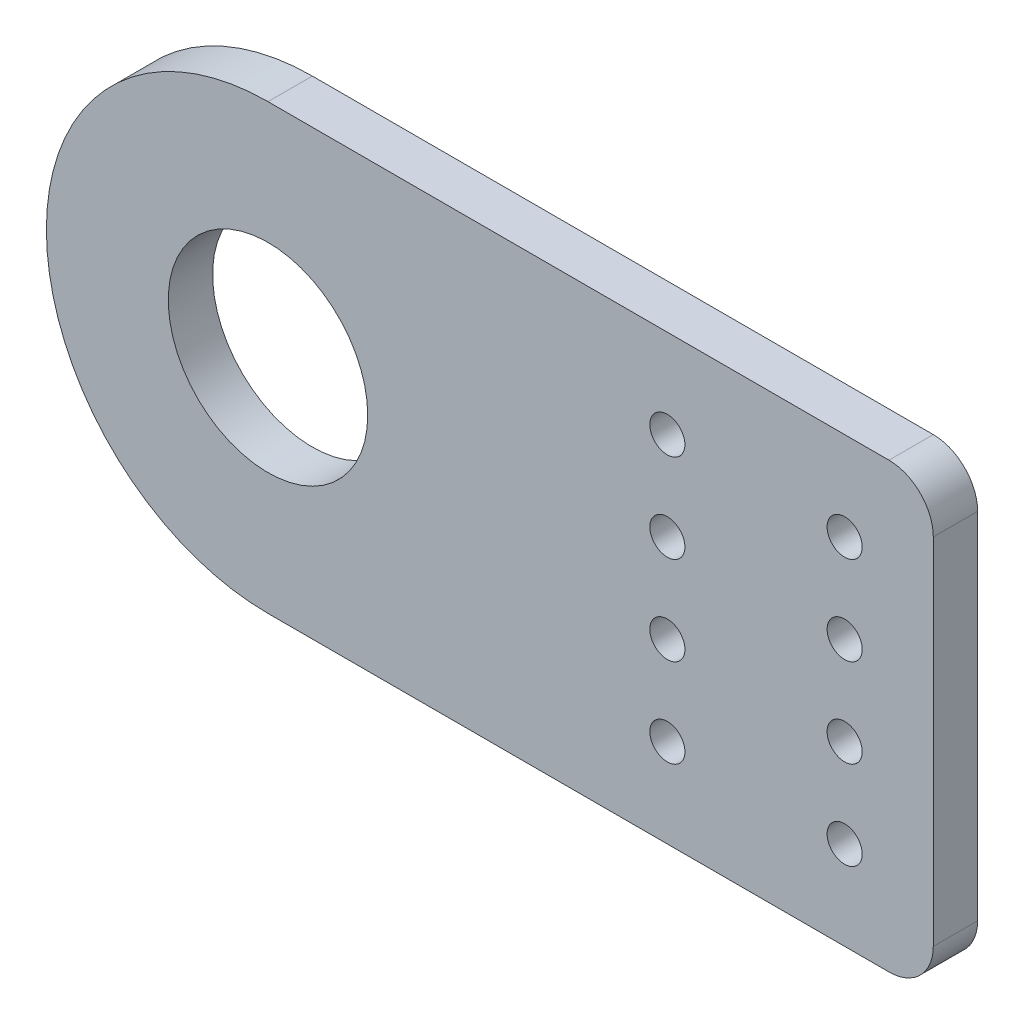
ISO-10303-21;
HEADER;
FILE_DESCRIPTION(('STEP AP214'),'2;1');
FILE_NAME('part.step','',(''),(''),'','','');
FILE_SCHEMA(('AUTOMOTIVE_DESIGN { 1 0 10303 214 1 1 1 1 }'));
ENDSEC;
DATA;
#1=APPLICATION_CONTEXT('core data for automotive mechanical design processes');
#2=APPLICATION_PROTOCOL_DEFINITION('international standard','automotive_design',2000,#1);
#3=PRODUCT_CONTEXT('',#1,'mechanical');
#4=PRODUCT('Part','Part','',(#3));
#5=PRODUCT_RELATED_PRODUCT_CATEGORY('part','',(#4));
#6=PRODUCT_DEFINITION_FORMATION('','',#4);
#7=PRODUCT_DEFINITION_CONTEXT('part definition',#1,'design');
#8=PRODUCT_DEFINITION('design','',#6,#7);
#9=PRODUCT_DEFINITION_SHAPE('','',#8);
#10=(LENGTH_UNIT() NAMED_UNIT(*) SI_UNIT(.MILLI.,.METRE.));
#11=(NAMED_UNIT(*) PLANE_ANGLE_UNIT() SI_UNIT($,.RADIAN.));
#12=(NAMED_UNIT(*) SI_UNIT($,.STERADIAN.) SOLID_ANGLE_UNIT());
#13=UNCERTAINTY_MEASURE_WITH_UNIT(LENGTH_MEASURE(1.E-05),#10,'distance_accuracy_value','');
#14=(GEOMETRIC_REPRESENTATION_CONTEXT(3) GLOBAL_UNCERTAINTY_ASSIGNED_CONTEXT((#13)) GLOBAL_UNIT_ASSIGNED_CONTEXT((#10,
#11,#12)) REPRESENTATION_CONTEXT('',''));
#15=CARTESIAN_POINT('',(0.,0.,0.));
#16=DIRECTION('',(0.,0.,1.));
#17=DIRECTION('',(1.,0.,0.));
#18=AXIS2_PLACEMENT_3D('',#15,#16,#17);
#19=CARTESIAN_POINT('',(-44.5121536799579,100.012500000049,6.35));
#20=DIRECTION('',(0.,0.,1.));
#21=DIRECTION('',(1.,0.,0.));
#22=AXIS2_PLACEMENT_3D('',#19,#20,#21);
#23=PLANE('',#22);
#24=CARTESIAN_POINT('',(12.7,119.062500000049,6.35));
#25=DIRECTION('',(0.,0.,1.));
#26=DIRECTION('',(1.,0.,0.));
#27=AXIS2_PLACEMENT_3D('',#24,#25,#26);
#28=CIRCLE('',#27,2.5146);
#29=CARTESIAN_POINT('',(15.2146,119.062500000049,6.35));
#30=VERTEX_POINT('',#29);
#31=EDGE_CURVE('E354',#30,#30,#28,.T.);
#32=ORIENTED_EDGE('',*,*,#31,.F.);
#33=EDGE_LOOP('',(#32));
#34=FACE_BOUND('',#33,.T.);
#35=CARTESIAN_POINT('',(12.7,93.662500000049,6.35));
#36=DIRECTION('',(0.,0.,1.));
#37=DIRECTION('',(1.,0.,0.));
#38=AXIS2_PLACEMENT_3D('',#35,#36,#37);
#39=CIRCLE('',#38,2.5146);
#40=CARTESIAN_POINT('',(15.2146,93.662500000049,6.35));
#41=VERTEX_POINT('',#40);
#42=EDGE_CURVE('E366',#41,#41,#39,.T.);
#43=ORIENTED_EDGE('',*,*,#42,.F.);
#44=EDGE_LOOP('',(#43));
#45=FACE_BOUND('',#44,.T.);
#46=CARTESIAN_POINT('',(38.1,80.962500000049,6.35));
#47=DIRECTION('',(0.,0.,1.));
#48=DIRECTION('',(1.,0.,0.));
#49=AXIS2_PLACEMENT_3D('',#46,#47,#48);
#50=CIRCLE('',#49,2.5146);
#51=CARTESIAN_POINT('',(40.6146,80.962500000049,6.35));
#52=VERTEX_POINT('',#51);
#53=EDGE_CURVE('E378',#52,#52,#50,.T.);
#54=ORIENTED_EDGE('',*,*,#53,.F.);
#55=EDGE_LOOP('',(#54));
#56=FACE_BOUND('',#55,.T.);
#57=CARTESIAN_POINT('',(38.1,106.362500000049,6.35));
#58=DIRECTION('',(0.,0.,1.));
#59=DIRECTION('',(1.,0.,0.));
#60=AXIS2_PLACEMENT_3D('',#57,#58,#59);
#61=CIRCLE('',#60,2.5146);
#62=CARTESIAN_POINT('',(40.6146,106.362500000049,6.35));
#63=VERTEX_POINT('',#62);
#64=EDGE_CURVE('E390',#63,#63,#61,.T.);
#65=ORIENTED_EDGE('',*,*,#64,.F.);
#66=EDGE_LOOP('',(#65));
#67=FACE_BOUND('',#66,.T.);
#68=DIRECTION('',(1.,0.,0.));
#69=VECTOR('',#68,1.);
#70=CARTESIAN_POINT('',(-44.5121536799579,68.262500000049,6.35));
#71=LINE('',#70,#69);
#72=CARTESIAN_POINT('',(-44.5121536799579,68.262500000049,6.35));
#73=VERTEX_POINT('',#72);
#74=CARTESIAN_POINT('',(44.45,68.262500000049,6.35));
#75=VERTEX_POINT('',#74);
#76=EDGE_CURVE('E92',#73,#75,#71,.T.);
#77=ORIENTED_EDGE('',*,*,#76,.T.);
#78=CARTESIAN_POINT('',(44.45,74.612500000049,6.35));
#79=DIRECTION('',(0.,0.,1.));
#80=DIRECTION('',(1.,0.,0.));
#81=AXIS2_PLACEMENT_3D('',#78,#79,#80);
#82=CIRCLE('',#81,6.35);
#83=CARTESIAN_POINT('',(50.8,74.612500000049,6.35));
#84=VERTEX_POINT('',#83);
#85=EDGE_CURVE('E47',#75,#84,#82,.T.);
#86=ORIENTED_EDGE('',*,*,#85,.T.);
#87=DIRECTION('',(0.,1.,0.));
#88=VECTOR('',#87,1.);
#89=CARTESIAN_POINT('',(50.8,68.262500000049,6.35));
#90=LINE('',#89,#88);
#91=CARTESIAN_POINT('',(50.8,125.412500000049,6.35));
#92=VERTEX_POINT('',#91);
#93=EDGE_CURVE('E99',#84,#92,#90,.T.);
#94=ORIENTED_EDGE('',*,*,#93,.T.);
#95=CARTESIAN_POINT('',(44.45,125.412500000049,6.35));
#96=DIRECTION('',(0.,0.,1.));
#97=DIRECTION('',(1.,0.,0.));
#98=AXIS2_PLACEMENT_3D('',#95,#96,#97);
#99=CIRCLE('',#98,6.35);
#100=CARTESIAN_POINT('',(44.45,131.762500000049,6.35));
#101=VERTEX_POINT('',#100);
#102=EDGE_CURVE('E54',#92,#101,#99,.T.);
#103=ORIENTED_EDGE('',*,*,#102,.T.);
#104=DIRECTION('',(-1.,0.,0.));
#105=VECTOR('',#104,1.);
#106=CARTESIAN_POINT('',(-44.5121536799579,131.762500000049,6.35));
#107=LINE('',#106,#105);
#108=CARTESIAN_POINT('',(-44.5121536799579,131.762500000049,6.35));
#109=VERTEX_POINT('',#108);
#110=EDGE_CURVE('E104',#101,#109,#107,.T.);
#111=ORIENTED_EDGE('',*,*,#110,.T.);
#112=CARTESIAN_POINT('',(-44.5121536799579,100.012500000049,6.35));
#113=DIRECTION('',(0.,0.,1.));
#114=DIRECTION('',(1.,0.,0.));
#115=AXIS2_PLACEMENT_3D('',#112,#113,#114);
#116=CIRCLE('',#115,31.75);
#117=EDGE_CURVE('E100',#109,#73,#116,.T.);
#118=ORIENTED_EDGE('',*,*,#117,.T.);
#119=EDGE_LOOP('',(#77,#86,#94,#103,#111,#118));
#120=FACE_BOUND('',#119,.T.);
#121=CARTESIAN_POINT('',(38.1,119.062500000049,6.35));
#122=DIRECTION('',(0.,0.,1.));
#123=DIRECTION('',(1.,0.,0.));
#124=AXIS2_PLACEMENT_3D('',#121,#122,#123);
#125=CIRCLE('',#124,2.51460000000001);
#126=CARTESIAN_POINT('',(40.6146,119.062500000049,6.35));
#127=VERTEX_POINT('',#126);
#128=EDGE_CURVE('E145',#127,#127,#125,.T.);
#129=ORIENTED_EDGE('',*,*,#128,.F.);
#130=EDGE_LOOP('',(#129));
#131=FACE_BOUND('',#130,.T.);
#132=CARTESIAN_POINT('',(38.1,93.662500000049,6.35));
#133=DIRECTION('',(0.,0.,1.));
#134=DIRECTION('',(1.,0.,0.));
#135=AXIS2_PLACEMENT_3D('',#132,#133,#134);
#136=CIRCLE('',#135,2.5146);
#137=CARTESIAN_POINT('',(40.6146,93.662500000049,6.35));
#138=VERTEX_POINT('',#137);
#139=EDGE_CURVE('E384',#138,#138,#136,.T.);
#140=ORIENTED_EDGE('',*,*,#139,.F.);
#141=EDGE_LOOP('',(#140));
#142=FACE_BOUND('',#141,.T.);
#143=CARTESIAN_POINT('',(12.7,80.962500000049,6.35));
#144=DIRECTION('',(0.,0.,1.));
#145=DIRECTION('',(1.,0.,0.));
#146=AXIS2_PLACEMENT_3D('',#143,#144,#145);
#147=CIRCLE('',#146,2.5146);
#148=CARTESIAN_POINT('',(15.2146,80.962500000049,6.35));
#149=VERTEX_POINT('',#148);
#150=EDGE_CURVE('E372',#149,#149,#147,.T.);
#151=ORIENTED_EDGE('',*,*,#150,.F.);
#152=EDGE_LOOP('',(#151));
#153=FACE_BOUND('',#152,.T.);
#154=CARTESIAN_POINT('',(12.7,106.362500000049,6.35));
#155=DIRECTION('',(0.,0.,1.));
#156=DIRECTION('',(1.,0.,0.));
#157=AXIS2_PLACEMENT_3D('',#154,#155,#156);
#158=CIRCLE('',#157,2.5146);
#159=CARTESIAN_POINT('',(15.2146,106.362500000049,6.35));
#160=VERTEX_POINT('',#159);
#161=EDGE_CURVE('E360',#160,#160,#158,.T.);
#162=ORIENTED_EDGE('',*,*,#161,.F.);
#163=EDGE_LOOP('',(#162));
#164=FACE_BOUND('',#163,.T.);
#165=CARTESIAN_POINT('',(-44.5121536799579,100.012500000049,6.35));
#166=DIRECTION('',(0.,0.,1.));
#167=DIRECTION('',(1.,0.,0.));
#168=AXIS2_PLACEMENT_3D('',#165,#166,#167);
#169=CIRCLE('',#168,14.2875);
#170=CARTESIAN_POINT('',(-30.2246536799579,100.012500000049,6.35));
#171=VERTEX_POINT('',#170);
#172=EDGE_CURVE('E345',#171,#171,#169,.T.);
#173=ORIENTED_EDGE('',*,*,#172,.F.);
#174=EDGE_LOOP('',(#173));
#175=FACE_BOUND('',#174,.T.);
#176=ADVANCED_FACE('F39',(#34,#45,#56,#67,#120,#131,#142,#153,#164,#175),#23,.T.);
#177=CARTESIAN_POINT('',(-44.5121536799579,100.012500000049,0.));
#178=DIRECTION('',(0.,0.,1.));
#179=DIRECTION('',(1.,0.,0.));
#180=AXIS2_PLACEMENT_3D('',#177,#178,#179);
#181=PLANE('',#180);
#182=DIRECTION('',(0.,1.,0.));
#183=VECTOR('',#182,1.);
#184=CARTESIAN_POINT('',(50.8,68.262500000049,0.));
#185=LINE('',#184,#183);
#186=CARTESIAN_POINT('',(50.8,74.612500000049,0.));
#187=VERTEX_POINT('',#186);
#188=CARTESIAN_POINT('',(50.8,125.412500000049,0.));
#189=VERTEX_POINT('',#188);
#190=EDGE_CURVE('E142',#187,#189,#185,.T.);
#191=ORIENTED_EDGE('',*,*,#190,.F.);
#192=CARTESIAN_POINT('',(44.45,74.612500000049,0.));
#193=DIRECTION('',(0.,0.,1.));
#194=DIRECTION('',(1.,0.,0.));
#195=AXIS2_PLACEMENT_3D('',#192,#193,#194);
#196=CIRCLE('',#195,6.35);
#197=CARTESIAN_POINT('',(44.45,68.262500000049,0.));
#198=VERTEX_POINT('',#197);
#199=EDGE_CURVE('E125',#187,#198,#196,.F.);
#200=ORIENTED_EDGE('',*,*,#199,.T.);
#201=DIRECTION('',(1.,0.,0.));
#202=VECTOR('',#201,1.);
#203=CARTESIAN_POINT('',(-44.5121536799579,68.262500000049,0.));
#204=LINE('',#203,#202);
#205=CARTESIAN_POINT('',(-44.5121536799579,68.262500000049,0.));
#206=VERTEX_POINT('',#205);
#207=EDGE_CURVE('E141',#206,#198,#204,.T.);
#208=ORIENTED_EDGE('',*,*,#207,.F.);
#209=CARTESIAN_POINT('',(-44.5121536799579,100.012500000049,0.));
#210=DIRECTION('',(0.,0.,1.));
#211=DIRECTION('',(1.,0.,0.));
#212=AXIS2_PLACEMENT_3D('',#209,#210,#211);
#213=CIRCLE('',#212,31.75);
#214=CARTESIAN_POINT('',(-44.5121536799579,131.762500000049,0.));
#215=VERTEX_POINT('',#214);
#216=EDGE_CURVE('E112',#215,#206,#213,.T.);
#217=ORIENTED_EDGE('',*,*,#216,.F.);
#218=DIRECTION('',(-1.,0.,0.));
#219=VECTOR('',#218,1.);
#220=CARTESIAN_POINT('',(-44.5121536799579,131.762500000049,0.));
#221=LINE('',#220,#219);
#222=CARTESIAN_POINT('',(44.45,131.762500000049,0.));
#223=VERTEX_POINT('',#222);
#224=EDGE_CURVE('E108',#223,#215,#221,.T.);
#225=ORIENTED_EDGE('',*,*,#224,.F.);
#226=CARTESIAN_POINT('',(44.45,125.412500000049,0.));
#227=DIRECTION('',(0.,0.,1.));
#228=DIRECTION('',(1.,0.,0.));
#229=AXIS2_PLACEMENT_3D('',#226,#227,#228);
#230=CIRCLE('',#229,6.35);
#231=EDGE_CURVE('E123',#223,#189,#230,.F.);
#232=ORIENTED_EDGE('',*,*,#231,.T.);
#233=EDGE_LOOP('',(#191,#200,#208,#217,#225,#232));
#234=FACE_BOUND('',#233,.T.);
#235=CARTESIAN_POINT('',(38.1,119.062500000049,0.));
#236=DIRECTION('',(0.,0.,1.));
#237=DIRECTION('',(1.,0.,0.));
#238=AXIS2_PLACEMENT_3D('',#235,#236,#237);
#239=CIRCLE('',#238,2.51460000000001);
#240=CARTESIAN_POINT('',(40.6146,119.062500000049,0.));
#241=VERTEX_POINT('',#240);
#242=EDGE_CURVE('E393',#241,#241,#239,.T.);
#243=ORIENTED_EDGE('',*,*,#242,.T.);
#244=EDGE_LOOP('',(#243));
#245=FACE_BOUND('',#244,.T.);
#246=CARTESIAN_POINT('',(38.1,106.362500000049,0.));
#247=DIRECTION('',(0.,0.,1.));
#248=DIRECTION('',(1.,0.,0.));
#249=AXIS2_PLACEMENT_3D('',#246,#247,#248);
#250=CIRCLE('',#249,2.5146);
#251=CARTESIAN_POINT('',(40.6146,106.362500000049,0.));
#252=VERTEX_POINT('',#251);
#253=EDGE_CURVE('E387',#252,#252,#250,.T.);
#254=ORIENTED_EDGE('',*,*,#253,.T.);
#255=EDGE_LOOP('',(#254));
#256=FACE_BOUND('',#255,.T.);
#257=CARTESIAN_POINT('',(38.1,93.662500000049,0.));
#258=DIRECTION('',(0.,0.,1.));
#259=DIRECTION('',(1.,0.,0.));
#260=AXIS2_PLACEMENT_3D('',#257,#258,#259);
#261=CIRCLE('',#260,2.5146);
#262=CARTESIAN_POINT('',(40.6146,93.662500000049,0.));
#263=VERTEX_POINT('',#262);
#264=EDGE_CURVE('E381',#263,#263,#261,.T.);
#265=ORIENTED_EDGE('',*,*,#264,.T.);
#266=EDGE_LOOP('',(#265));
#267=FACE_BOUND('',#266,.T.);
#268=CARTESIAN_POINT('',(38.1,80.962500000049,0.));
#269=DIRECTION('',(0.,0.,1.));
#270=DIRECTION('',(1.,0.,0.));
#271=AXIS2_PLACEMENT_3D('',#268,#269,#270);
#272=CIRCLE('',#271,2.5146);
#273=CARTESIAN_POINT('',(40.6146,80.962500000049,0.));
#274=VERTEX_POINT('',#273);
#275=EDGE_CURVE('E375',#274,#274,#272,.T.);
#276=ORIENTED_EDGE('',*,*,#275,.T.);
#277=EDGE_LOOP('',(#276));
#278=FACE_BOUND('',#277,.T.);
#279=CARTESIAN_POINT('',(12.7,80.962500000049,0.));
#280=DIRECTION('',(0.,0.,1.));
#281=DIRECTION('',(1.,0.,0.));
#282=AXIS2_PLACEMENT_3D('',#279,#280,#281);
#283=CIRCLE('',#282,2.5146);
#284=CARTESIAN_POINT('',(15.2146,80.962500000049,0.));
#285=VERTEX_POINT('',#284);
#286=EDGE_CURVE('E369',#285,#285,#283,.T.);
#287=ORIENTED_EDGE('',*,*,#286,.T.);
#288=EDGE_LOOP('',(#287));
#289=FACE_BOUND('',#288,.T.);
#290=CARTESIAN_POINT('',(12.7,93.662500000049,0.));
#291=DIRECTION('',(0.,0.,1.));
#292=DIRECTION('',(1.,0.,0.));
#293=AXIS2_PLACEMENT_3D('',#290,#291,#292);
#294=CIRCLE('',#293,2.5146);
#295=CARTESIAN_POINT('',(15.2146,93.662500000049,0.));
#296=VERTEX_POINT('',#295);
#297=EDGE_CURVE('E363',#296,#296,#294,.T.);
#298=ORIENTED_EDGE('',*,*,#297,.T.);
#299=EDGE_LOOP('',(#298));
#300=FACE_BOUND('',#299,.T.);
#301=CARTESIAN_POINT('',(12.7,106.362500000049,0.));
#302=DIRECTION('',(0.,0.,1.));
#303=DIRECTION('',(1.,0.,0.));
#304=AXIS2_PLACEMENT_3D('',#301,#302,#303);
#305=CIRCLE('',#304,2.5146);
#306=CARTESIAN_POINT('',(15.2146,106.362500000049,0.));
#307=VERTEX_POINT('',#306);
#308=EDGE_CURVE('E357',#307,#307,#305,.T.);
#309=ORIENTED_EDGE('',*,*,#308,.T.);
#310=EDGE_LOOP('',(#309));
#311=FACE_BOUND('',#310,.T.);
#312=CARTESIAN_POINT('',(12.7,119.062500000049,0.));
#313=DIRECTION('',(0.,0.,1.));
#314=DIRECTION('',(1.,0.,0.));
#315=AXIS2_PLACEMENT_3D('',#312,#313,#314);
#316=CIRCLE('',#315,2.5146);
#317=CARTESIAN_POINT('',(15.2146,119.062500000049,0.));
#318=VERTEX_POINT('',#317);
#319=EDGE_CURVE('E351',#318,#318,#316,.T.);
#320=ORIENTED_EDGE('',*,*,#319,.T.);
#321=EDGE_LOOP('',(#320));
#322=FACE_BOUND('',#321,.T.);
#323=CARTESIAN_POINT('',(-44.5121536799579,100.012500000049,0.));
#324=DIRECTION('',(0.,0.,1.));
#325=DIRECTION('',(1.,0.,0.));
#326=AXIS2_PLACEMENT_3D('',#323,#324,#325);
#327=CIRCLE('',#326,14.2875);
#328=CARTESIAN_POINT('',(-30.2246536799579,100.012500000049,0.));
#329=VERTEX_POINT('',#328);
#330=EDGE_CURVE('E348',#329,#329,#327,.T.);
#331=ORIENTED_EDGE('',*,*,#330,.T.);
#332=EDGE_LOOP('',(#331));
#333=FACE_BOUND('',#332,.T.);
#334=ADVANCED_FACE('F139',(#234,#245,#256,#267,#278,#289,#300,#311,#322,#333),#181,.F.);
#335=CARTESIAN_POINT('',(-44.5121536799579,100.012500000049,6.35));
#336=DIRECTION('',(0.,0.,-1.));
#337=DIRECTION('',(-1.,0.,0.));
#338=AXIS2_PLACEMENT_3D('',#335,#336,#337);
#339=CYLINDRICAL_SURFACE('',#338,31.75);
#340=ORIENTED_EDGE('',*,*,#216,.T.);
#341=DIRECTION('',(0.,0.,-1.));
#342=VECTOR('',#341,1.);
#343=CARTESIAN_POINT('',(-44.5121536799579,68.262500000049,6.35));
#344=LINE('',#343,#342);
#345=EDGE_CURVE('E96',#73,#206,#344,.T.);
#346=ORIENTED_EDGE('',*,*,#345,.F.);
#347=ORIENTED_EDGE('',*,*,#117,.F.);
#348=DIRECTION('',(0.,0.,-1.));
#349=VECTOR('',#348,1.);
#350=CARTESIAN_POINT('',(-44.5121536799579,131.762500000049,6.35));
#351=LINE('',#350,#349);
#352=EDGE_CURVE('E114',#109,#215,#351,.T.);
#353=ORIENTED_EDGE('',*,*,#352,.T.);
#354=EDGE_LOOP('',(#340,#346,#347,#353));
#355=FACE_BOUND('',#354,.T.);
#356=ADVANCED_FACE('F110',(#355),#339,.T.);
#357=CARTESIAN_POINT('',(-44.5121536799579,68.262500000049,6.35));
#358=DIRECTION('',(0.,1.,0.));
#359=DIRECTION('',(0.,0.,1.));
#360=AXIS2_PLACEMENT_3D('',#357,#358,#359);
#361=PLANE('',#360);
#362=ORIENTED_EDGE('',*,*,#207,.T.);
#363=DIRECTION('',(0.,0.,-1.));
#364=VECTOR('',#363,1.);
#365=CARTESIAN_POINT('',(44.45,68.262500000049,6.35));
#366=LINE('',#365,#364);
#367=EDGE_CURVE('E62',#198,#75,#366,.F.);
#368=ORIENTED_EDGE('',*,*,#367,.T.);
#369=ORIENTED_EDGE('',*,*,#76,.F.);
#370=ORIENTED_EDGE('',*,*,#345,.T.);
#371=EDGE_LOOP('',(#362,#368,#369,#370));
#372=FACE_BOUND('',#371,.T.);
#373=ADVANCED_FACE('F94',(#372),#361,.F.);
#374=CARTESIAN_POINT('',(50.8,68.262500000049,6.35));
#375=DIRECTION('',(-1.,0.,0.));
#376=DIRECTION('',(0.,0.,1.));
#377=AXIS2_PLACEMENT_3D('',#374,#375,#376);
#378=PLANE('',#377);
#379=ORIENTED_EDGE('',*,*,#93,.F.);
#380=DIRECTION('',(0.,0.,-1.));
#381=VECTOR('',#380,1.);
#382=CARTESIAN_POINT('',(50.8,74.612500000049,6.35));
#383=LINE('',#382,#381);
#384=EDGE_CURVE('E116',#84,#187,#383,.T.);
#385=ORIENTED_EDGE('',*,*,#384,.T.);
#386=ORIENTED_EDGE('',*,*,#190,.T.);
#387=DIRECTION('',(0.,0.,-1.));
#388=VECTOR('',#387,1.);
#389=CARTESIAN_POINT('',(50.8,125.412500000049,6.35));
#390=LINE('',#389,#388);
#391=EDGE_CURVE('E113',#189,#92,#390,.F.);
#392=ORIENTED_EDGE('',*,*,#391,.T.);
#393=EDGE_LOOP('',(#379,#385,#386,#392));
#394=FACE_BOUND('',#393,.T.);
#395=ADVANCED_FACE('F132',(#394),#378,.F.);
#396=CARTESIAN_POINT('',(-44.5121536799579,131.762500000049,6.35));
#397=DIRECTION('',(0.,-1.,0.));
#398=DIRECTION('',(0.,0.,-1.));
#399=AXIS2_PLACEMENT_3D('',#396,#397,#398);
#400=PLANE('',#399);
#401=ORIENTED_EDGE('',*,*,#110,.F.);
#402=DIRECTION('',(0.,0.,-1.));
#403=VECTOR('',#402,1.);
#404=CARTESIAN_POINT('',(44.45,131.762500000049,6.35));
#405=LINE('',#404,#403);
#406=EDGE_CURVE('E11',#101,#223,#405,.T.);
#407=ORIENTED_EDGE('',*,*,#406,.T.);
#408=ORIENTED_EDGE('',*,*,#224,.T.);
#409=ORIENTED_EDGE('',*,*,#352,.F.);
#410=EDGE_LOOP('',(#401,#407,#408,#409));
#411=FACE_BOUND('',#410,.T.);
#412=ADVANCED_FACE('F150',(#411),#400,.F.);
#413=CARTESIAN_POINT('',(38.1,119.062500000049,6.35));
#414=DIRECTION('',(0.,0.,-1.));
#415=DIRECTION('',(-1.,0.,0.));
#416=AXIS2_PLACEMENT_3D('',#413,#414,#415);
#417=CYLINDRICAL_SURFACE('',#416,2.51460000000001);
#418=ORIENTED_EDGE('',*,*,#128,.T.);
#419=EDGE_LOOP('',(#418));
#420=FACE_BOUND('',#419,.T.);
#421=ORIENTED_EDGE('',*,*,#242,.F.);
#422=EDGE_LOOP('',(#421));
#423=FACE_BOUND('',#422,.T.);
#424=ADVANCED_FACE('F168',(#420,#423),#417,.F.);
#425=CARTESIAN_POINT('',(38.1,106.362500000049,6.35));
#426=DIRECTION('',(0.,0.,-1.));
#427=DIRECTION('',(-1.,0.,0.));
#428=AXIS2_PLACEMENT_3D('',#425,#426,#427);
#429=CYLINDRICAL_SURFACE('',#428,2.5146);
#430=ORIENTED_EDGE('',*,*,#64,.T.);
#431=EDGE_LOOP('',(#430));
#432=FACE_BOUND('',#431,.T.);
#433=ORIENTED_EDGE('',*,*,#253,.F.);
#434=EDGE_LOOP('',(#433));
#435=FACE_BOUND('',#434,.T.);
#436=ADVANCED_FACE('F201',(#432,#435),#429,.F.);
#437=CARTESIAN_POINT('',(38.1,93.662500000049,6.35));
#438=DIRECTION('',(0.,0.,-1.));
#439=DIRECTION('',(-1.,0.,0.));
#440=AXIS2_PLACEMENT_3D('',#437,#438,#439);
#441=CYLINDRICAL_SURFACE('',#440,2.5146);
#442=ORIENTED_EDGE('',*,*,#139,.T.);
#443=EDGE_LOOP('',(#442));
#444=FACE_BOUND('',#443,.T.);
#445=ORIENTED_EDGE('',*,*,#264,.F.);
#446=EDGE_LOOP('',(#445));
#447=FACE_BOUND('',#446,.T.);
#448=ADVANCED_FACE('F208',(#444,#447),#441,.F.);
#449=CARTESIAN_POINT('',(38.1,80.962500000049,6.35));
#450=DIRECTION('',(0.,0.,-1.));
#451=DIRECTION('',(-1.,0.,0.));
#452=AXIS2_PLACEMENT_3D('',#449,#450,#451);
#453=CYLINDRICAL_SURFACE('',#452,2.5146);
#454=ORIENTED_EDGE('',*,*,#53,.T.);
#455=EDGE_LOOP('',(#454));
#456=FACE_BOUND('',#455,.T.);
#457=ORIENTED_EDGE('',*,*,#275,.F.);
#458=EDGE_LOOP('',(#457));
#459=FACE_BOUND('',#458,.T.);
#460=ADVANCED_FACE('F215',(#456,#459),#453,.F.);
#461=CARTESIAN_POINT('',(12.7,80.962500000049,6.35));
#462=DIRECTION('',(0.,0.,-1.));
#463=DIRECTION('',(-1.,0.,0.));
#464=AXIS2_PLACEMENT_3D('',#461,#462,#463);
#465=CYLINDRICAL_SURFACE('',#464,2.5146);
#466=ORIENTED_EDGE('',*,*,#150,.T.);
#467=EDGE_LOOP('',(#466));
#468=FACE_BOUND('',#467,.T.);
#469=ORIENTED_EDGE('',*,*,#286,.F.);
#470=EDGE_LOOP('',(#469));
#471=FACE_BOUND('',#470,.T.);
#472=ADVANCED_FACE('F223',(#468,#471),#465,.F.);
#473=CARTESIAN_POINT('',(12.7,93.662500000049,6.35));
#474=DIRECTION('',(0.,0.,-1.));
#475=DIRECTION('',(-1.,0.,0.));
#476=AXIS2_PLACEMENT_3D('',#473,#474,#475);
#477=CYLINDRICAL_SURFACE('',#476,2.5146);
#478=ORIENTED_EDGE('',*,*,#42,.T.);
#479=EDGE_LOOP('',(#478));
#480=FACE_BOUND('',#479,.T.);
#481=ORIENTED_EDGE('',*,*,#297,.F.);
#482=EDGE_LOOP('',(#481));
#483=FACE_BOUND('',#482,.T.);
#484=ADVANCED_FACE('F231',(#480,#483),#477,.F.);
#485=CARTESIAN_POINT('',(12.7,106.362500000049,6.35));
#486=DIRECTION('',(0.,0.,-1.));
#487=DIRECTION('',(-1.,0.,0.));
#488=AXIS2_PLACEMENT_3D('',#485,#486,#487);
#489=CYLINDRICAL_SURFACE('',#488,2.5146);
#490=ORIENTED_EDGE('',*,*,#161,.T.);
#491=EDGE_LOOP('',(#490));
#492=FACE_BOUND('',#491,.T.);
#493=ORIENTED_EDGE('',*,*,#308,.F.);
#494=EDGE_LOOP('',(#493));
#495=FACE_BOUND('',#494,.T.);
#496=ADVANCED_FACE('F239',(#492,#495),#489,.F.);
#497=CARTESIAN_POINT('',(12.7,119.062500000049,6.35));
#498=DIRECTION('',(0.,0.,-1.));
#499=DIRECTION('',(-1.,0.,0.));
#500=AXIS2_PLACEMENT_3D('',#497,#498,#499);
#501=CYLINDRICAL_SURFACE('',#500,2.5146);
#502=ORIENTED_EDGE('',*,*,#31,.T.);
#503=EDGE_LOOP('',(#502));
#504=FACE_BOUND('',#503,.T.);
#505=ORIENTED_EDGE('',*,*,#319,.F.);
#506=EDGE_LOOP('',(#505));
#507=FACE_BOUND('',#506,.T.);
#508=ADVANCED_FACE('F247',(#504,#507),#501,.F.);
#509=CARTESIAN_POINT('',(-44.5121536799579,100.012500000049,6.35));
#510=DIRECTION('',(0.,0.,-1.));
#511=DIRECTION('',(-1.,0.,0.));
#512=AXIS2_PLACEMENT_3D('',#509,#510,#511);
#513=CYLINDRICAL_SURFACE('',#512,14.2875);
#514=ORIENTED_EDGE('',*,*,#172,.T.);
#515=EDGE_LOOP('',(#514));
#516=FACE_BOUND('',#515,.T.);
#517=ORIENTED_EDGE('',*,*,#330,.F.);
#518=EDGE_LOOP('',(#517));
#519=FACE_BOUND('',#518,.T.);
#520=ADVANCED_FACE('F157',(#516,#519),#513,.F.);
#521=CARTESIAN_POINT('',(44.45,74.612500000049,6.35));
#522=DIRECTION('',(0.,0.,-1.));
#523=DIRECTION('',(-1.,0.,0.));
#524=AXIS2_PLACEMENT_3D('',#521,#522,#523);
#525=CYLINDRICAL_SURFACE('',#524,6.35);
#526=ORIENTED_EDGE('',*,*,#85,.F.);
#527=ORIENTED_EDGE('',*,*,#367,.F.);
#528=ORIENTED_EDGE('',*,*,#199,.F.);
#529=ORIENTED_EDGE('',*,*,#384,.F.);
#530=EDGE_LOOP('',(#526,#527,#528,#529));
#531=FACE_BOUND('',#530,.T.);
#532=ADVANCED_FACE('F137',(#531),#525,.T.);
#533=CARTESIAN_POINT('',(44.45,125.412500000049,6.35));
#534=DIRECTION('',(0.,0.,-1.));
#535=DIRECTION('',(-1.,0.,0.));
#536=AXIS2_PLACEMENT_3D('',#533,#534,#535);
#537=CYLINDRICAL_SURFACE('',#536,6.35);
#538=ORIENTED_EDGE('',*,*,#102,.F.);
#539=ORIENTED_EDGE('',*,*,#391,.F.);
#540=ORIENTED_EDGE('',*,*,#231,.F.);
#541=ORIENTED_EDGE('',*,*,#406,.F.);
#542=EDGE_LOOP('',(#538,#539,#540,#541));
#543=FACE_BOUND('',#542,.T.);
#544=ADVANCED_FACE('F41',(#543),#537,.T.);
#545=CLOSED_SHELL('',(#176,#334,#356,#373,#395,#412,#424,#436,#448,#460,#472,#484,#496,#508,
#520,#532,#544));
#546=MANIFOLD_SOLID_BREP('B2',#545);
#547=ADVANCED_BREP_SHAPE_REPRESENTATION('',(#18,#546),#14);
#548=SHAPE_DEFINITION_REPRESENTATION(#9,#547);
ENDSEC;
END-ISO-10303-21;
